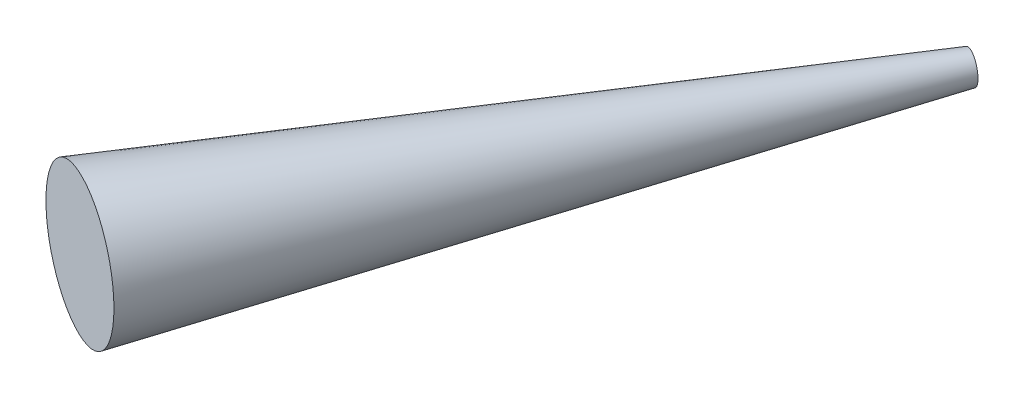
ISO-10303-21;
HEADER;
FILE_DESCRIPTION(('STEP AP214'),'2;1');
FILE_NAME('part.step','',(''),(''),'','','');
FILE_SCHEMA(('AUTOMOTIVE_DESIGN { 1 0 10303 214 1 1 1 1 }'));
ENDSEC;
DATA;
#1=APPLICATION_CONTEXT('core data for automotive mechanical design processes');
#2=APPLICATION_PROTOCOL_DEFINITION('international standard','automotive_design',2000,#1);
#3=PRODUCT_CONTEXT('',#1,'mechanical');
#4=PRODUCT('Part','Part','',(#3));
#5=PRODUCT_RELATED_PRODUCT_CATEGORY('part','',(#4));
#6=PRODUCT_DEFINITION_FORMATION('','',#4);
#7=PRODUCT_DEFINITION_CONTEXT('part definition',#1,'design');
#8=PRODUCT_DEFINITION('design','',#6,#7);
#9=PRODUCT_DEFINITION_SHAPE('','',#8);
#10=(LENGTH_UNIT() NAMED_UNIT(*) SI_UNIT(.MILLI.,.METRE.));
#11=(NAMED_UNIT(*) PLANE_ANGLE_UNIT() SI_UNIT($,.RADIAN.));
#12=(NAMED_UNIT(*) SI_UNIT($,.STERADIAN.) SOLID_ANGLE_UNIT());
#13=UNCERTAINTY_MEASURE_WITH_UNIT(LENGTH_MEASURE(1.E-05),#10,'distance_accuracy_value','');
#14=(GEOMETRIC_REPRESENTATION_CONTEXT(3) GLOBAL_UNCERTAINTY_ASSIGNED_CONTEXT((#13)) GLOBAL_UNIT_ASSIGNED_CONTEXT((#10,
#11,#12)) REPRESENTATION_CONTEXT('',''));
#15=CARTESIAN_POINT('',(0.,0.,0.));
#16=DIRECTION('',(0.,0.,1.));
#17=DIRECTION('',(1.,0.,0.));
#18=AXIS2_PLACEMENT_3D('',#15,#16,#17);
#19=CARTESIAN_POINT('',(-118.551117592453,0.,231.559629708371));
#20=DIRECTION('',(-0.4226182617407,0.,0.90630778703665));
#21=DIRECTION('',(0.90630778703665,0.,0.4226182617407));
#22=AXIS2_PLACEMENT_3D('',#19,#20,#21);
#23=CONICAL_SURFACE('',#22,22.209470215236,0.0822684399663295);
#24=CARTESIAN_POINT('',(-29.0373115484117,0.,39.5966531657745));
#25=DIRECTION('',(0.4226182617407,0.,-0.90630778703665));
#26=DIRECTION('',(-0.90630778703665,0.,-0.4226182617407));
#27=AXIS2_PLACEMENT_3D('',#24,#25,#26);
#28=CIRCLE('',#27,4.74496209597413);
#29=CARTESIAN_POINT('',(-24.7369154516366,0.,41.6019607988006));
#30=VERTEX_POINT('',#29);
#31=EDGE_CURVE('E11',#30,#30,#28,.T.);
#32=CARTESIAN_POINT('',(-118.551117592453,0.,231.559629708371));
#33=DIRECTION('',(0.4226182617407,0.,-0.90630778703665));
#34=DIRECTION('',(-0.90630778703665,0.,-0.4226182617407));
#35=AXIS2_PLACEMENT_3D('',#32,#33,#34);
#36=CIRCLE('',#35,22.209470215236);
#37=CARTESIAN_POINT('',(-98.4225017904263,0.,240.945757404916));
#38=VERTEX_POINT('',#37);
#39=EDGE_CURVE('E48',#38,#38,#36,.T.);
#40=CARTESIAN_POINT('',(-24.7369154516366,0.,41.6019607988006));
#41=CARTESIAN_POINT('',(-25.5044736426657,0.,43.6784586801143));
#42=CARTESIAN_POINT('',(-26.2720318336947,0.,45.754956561428));
#43=CARTESIAN_POINT('',(-27.8071482157528,0.,49.9079523240554));
#44=CARTESIAN_POINT('',(-28.5747064067819,0.,51.9844502053691));
#45=CARTESIAN_POINT('',(-30.10982278884,0.,56.1374459679965));
#46=CARTESIAN_POINT('',(-30.8773809798691,0.,58.2139438493102));
#47=CARTESIAN_POINT('',(-32.4124973619272,0.,62.3669396119376));
#48=CARTESIAN_POINT('',(-33.1800555529563,0.,64.4434374932513));
#49=CARTESIAN_POINT('',(-34.7151719350144,0.,68.5964332558788));
#50=CARTESIAN_POINT('',(-35.4827301260434,0.,70.6729311371925));
#51=CARTESIAN_POINT('',(-37.0178465081016,0.,74.8259268998199));
#52=CARTESIAN_POINT('',(-37.7854046991306,0.,76.9024247811336));
#53=CARTESIAN_POINT('',(-39.3205210811887,0.,81.055420543761));
#54=CARTESIAN_POINT('',(-40.0880792722178,0.,83.1319184250747));
#55=CARTESIAN_POINT('',(-41.6231956542759,0.,87.2849141877021));
#56=CARTESIAN_POINT('',(-42.390753845305,0.,89.3614120690158));
#57=CARTESIAN_POINT('',(-43.9258702273631,0.,93.5144078316432));
#58=CARTESIAN_POINT('',(-44.6934284183921,0.,95.5909057129569));
#59=CARTESIAN_POINT('',(-46.2285448004503,0.,99.7439014755843));
#60=CARTESIAN_POINT('',(-46.9961029914793,0.,101.820399356898));
#61=CARTESIAN_POINT('',(-48.5312193735374,0.,105.973395119525));
#62=CARTESIAN_POINT('',(-49.2987775645665,0.,108.049893000839));
#63=CARTESIAN_POINT('',(-50.8338939466246,0.,112.202888763467));
#64=CARTESIAN_POINT('',(-51.6014521376537,0.,114.27938664478));
#65=CARTESIAN_POINT('',(-53.1365685197118,0.,118.432382407408));
#66=CARTESIAN_POINT('',(-53.9041267107409,0.,120.508880288721));
#67=CARTESIAN_POINT('',(-55.439243092799,0.,124.661876051349));
#68=CARTESIAN_POINT('',(-56.206801283828,0.,126.738373932663));
#69=CARTESIAN_POINT('',(-57.7419176658862,0.,130.89136969529));
#70=CARTESIAN_POINT('',(-58.5094758569152,0.,132.967867576604));
#71=CARTESIAN_POINT('',(-60.0445922389733,0.,137.120863339231));
#72=CARTESIAN_POINT('',(-60.8121504300024,0.,139.197361220545));
#73=CARTESIAN_POINT('',(-62.3472668120605,0.,143.350356983172));
#74=CARTESIAN_POINT('',(-63.1148250030896,0.,145.426854864486));
#75=CARTESIAN_POINT('',(-64.6499413851477,0.,149.579850627113));
#76=CARTESIAN_POINT('',(-65.4174995761768,0.,151.656348508427));
#77=CARTESIAN_POINT('',(-66.9526159582349,0.,155.809344271054));
#78=CARTESIAN_POINT('',(-67.7201741492639,0.,157.885842152368));
#79=CARTESIAN_POINT('',(-69.255290531322,0.,162.038837914995));
#80=CARTESIAN_POINT('',(-70.0228487223511,0.,164.115335796309));
#81=CARTESIAN_POINT('',(-71.5579651044092,0.,168.268331558937));
#82=CARTESIAN_POINT('',(-72.3255232954383,0.,170.34482944025));
#83=CARTESIAN_POINT('',(-73.8606396774964,0.,174.497825202878));
#84=CARTESIAN_POINT('',(-74.6281978685255,0.,176.574323084191));
#85=CARTESIAN_POINT('',(-76.1633142505836,0.,180.727318846819));
#86=CARTESIAN_POINT('',(-76.9308724416126,0.,182.803816728133));
#87=CARTESIAN_POINT('',(-78.4659888236708,0.,186.95681249076));
#88=CARTESIAN_POINT('',(-79.2335470146998,0.,189.033310372074));
#89=CARTESIAN_POINT('',(-80.7686633967579,0.,193.186306134701));
#90=CARTESIAN_POINT('',(-81.536221587787,0.,195.262804016015));
#91=CARTESIAN_POINT('',(-83.0713379698451,0.,199.415799778642));
#92=CARTESIAN_POINT('',(-83.8388961608742,0.,201.492297659956));
#93=CARTESIAN_POINT('',(-85.3740125429323,0.,205.645293422583));
#94=CARTESIAN_POINT('',(-86.1415707339613,0.,207.721791303897));
#95=CARTESIAN_POINT('',(-87.6766871160195,0.,211.874787066524));
#96=CARTESIAN_POINT('',(-88.4442453070485,0.,213.951284947838));
#97=CARTESIAN_POINT('',(-89.9793616891067,0.,218.104280710466));
#98=CARTESIAN_POINT('',(-90.7469198801357,0.,220.180778591779));
#99=CARTESIAN_POINT('',(-92.2820362621938,0.,224.333774354407));
#100=CARTESIAN_POINT('',(-93.0495944532229,0.,226.41027223572));
#101=CARTESIAN_POINT('',(-94.584710835281,0.,230.563267998348));
#102=CARTESIAN_POINT('',(-95.3522690263101,0.,232.639765879661));
#103=CARTESIAN_POINT('',(-96.8873854083682,0.,236.792761642289));
#104=CARTESIAN_POINT('',(-97.6549435993972,0.,238.869259523603));
#105=CARTESIAN_POINT('',(-98.4225017904263,0.,240.945757404916));
#106=B_SPLINE_CURVE_WITH_KNOTS('',3,(#40,#41,#42,#43,#44,#45,#46,#47,#48,#49,#50,#51,#52,#53,
#54,#55,#56,#57,#58,#59,#60,#61,#62,#63,#64,#65,#66,#67,#68,#69,#70,#71,#72,#73,#74,#75,#76,#77,
#78,#79,#80,#81,#82,#83,#84,#85,#86,#87,#88,#89,#90,#91,#92,#93,#94,#95,#96,#97,#98,#99,#100,
#101,#102,#103,#104,#105),.UNSPECIFIED.,.F.,.F.,(4,2,2,2,2,2,2,2,2,2,2,2,2,2,2,2,2,2,2,2,2,2,2,
2,2,2,2,2,2,2,2,2,4),(0.,6.64145324830681,13.2829064966136,19.9243597449204,26.5658129932272,
33.207266241534,39.8487194898408,46.4901727381476,53.1316259864544,59.7730792347612,
66.414532483068,73.0559857313748,79.6974389796816,86.3388922279885,92.9803454762952,
99.621798724602,106.263251972909,112.904705221216,119.546158469522,126.187611717829,
132.829064966136,139.470518214443,146.11197146275,152.753424711056,159.394877959363,
166.03633120767,172.677784455977,179.319237704284,185.96069095259,192.602144200897,
199.243597449204,205.885050697511,212.526503945818),.UNSPECIFIED.);
#107=EDGE_CURVE('BSEAM41',#30,#38,#106,.T.);
#108=ORIENTED_EDGE('',*,*,#31,.F.);
#109=ORIENTED_EDGE('',*,*,#39,.T.);
#110=ORIENTED_EDGE('',*,*,#107,.T.);
#111=ORIENTED_EDGE('',*,*,#107,.F.);
#112=EDGE_LOOP('',(#108,#110,#109,#111));
#113=FACE_BOUND('',#112,.T.);
#114=ADVANCED_FACE('F41',(#113),#23,.T.);
#115=CARTESIAN_POINT('',(-29.0373115484117,0.,39.5966531657745));
#116=DIRECTION('',(0.4226182617407,0.,-0.90630778703665));
#117=DIRECTION('',(-0.90630778703665,0.,-0.4226182617407));
#118=AXIS2_PLACEMENT_3D('',#115,#116,#117);
#119=CONICAL_SURFACE('',#118,4.74496209597413,1.46607657167524);
#120=CARTESIAN_POINT('',(-29.2480778736533,0.,40.0486430088656));
#121=VERTEX_POINT('',#120);
#122=VERTEX_LOOP('',#121);
#123=FACE_BOUND('',#122,.T.);
#124=ORIENTED_EDGE('',*,*,#31,.T.);
#125=EDGE_LOOP('',(#124));
#126=FACE_BOUND('',#125,.T.);
#127=ADVANCED_FACE('F51',(#123,#126),#119,.F.);
#128=CARTESIAN_POINT('',(-109.866447839159,0.,235.609357722879));
#129=DIRECTION('',(0.4226182617407,0.,-0.90630778703665));
#130=DIRECTION('',(-0.90630778703665,0.,-0.4226182617407));
#131=AXIS2_PLACEMENT_3D('',#128,#129,#130);
#132=PLANE('',#131);
#133=ORIENTED_EDGE('',*,*,#39,.F.);
#134=EDGE_LOOP('',(#133));
#135=FACE_BOUND('',#134,.T.);
#136=ADVANCED_FACE('F54',(#135),#132,.F.);
#137=CLOSED_SHELL('',(#114,#127,#136));
#138=MANIFOLD_SOLID_BREP('B2',#137);
#139=ADVANCED_BREP_SHAPE_REPRESENTATION('',(#18,#138),#14);
#140=SHAPE_DEFINITION_REPRESENTATION(#9,#139);
ENDSEC;
END-ISO-10303-21;
